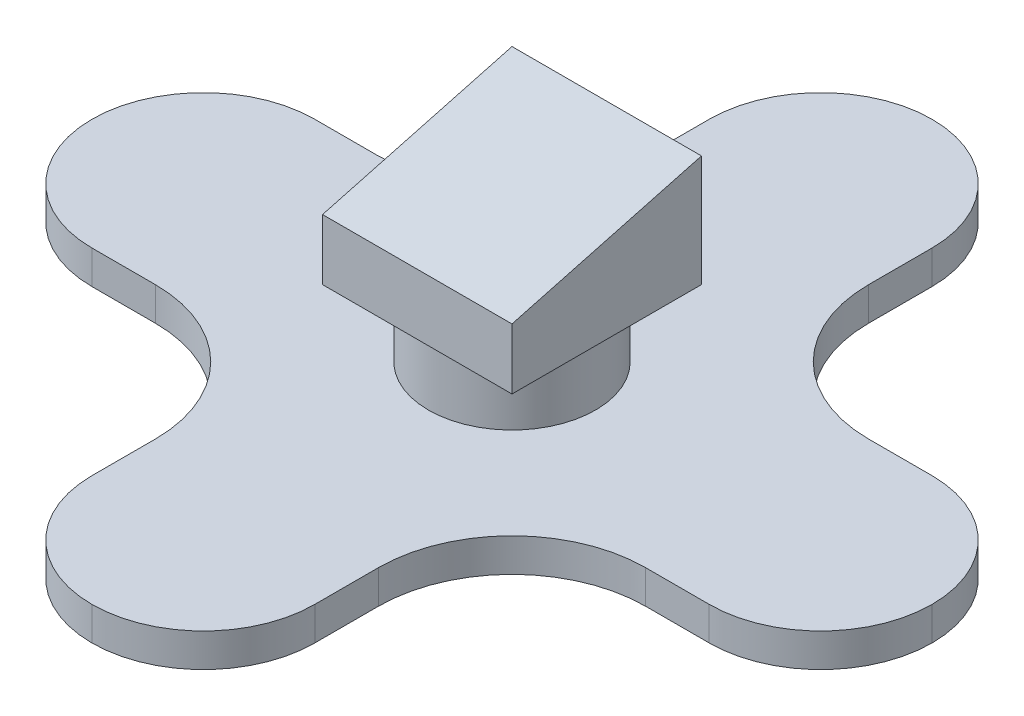
ISO-10303-21;
HEADER;
FILE_DESCRIPTION(('STEP AP214'),'2;1');
FILE_NAME('part.step','',(''),(''),'','','');
FILE_SCHEMA(('AUTOMOTIVE_DESIGN { 1 0 10303 214 1 1 1 1 }'));
ENDSEC;
DATA;
#1=APPLICATION_CONTEXT('core data for automotive mechanical design processes');
#2=APPLICATION_PROTOCOL_DEFINITION('international standard','automotive_design',2000,#1);
#3=PRODUCT_CONTEXT('',#1,'mechanical');
#4=PRODUCT('Part','Part','',(#3));
#5=PRODUCT_RELATED_PRODUCT_CATEGORY('part','',(#4));
#6=PRODUCT_DEFINITION_FORMATION('','',#4);
#7=PRODUCT_DEFINITION_CONTEXT('part definition',#1,'design');
#8=PRODUCT_DEFINITION('design','',#6,#7);
#9=PRODUCT_DEFINITION_SHAPE('','',#8);
#10=(LENGTH_UNIT() NAMED_UNIT(*) SI_UNIT(.MILLI.,.METRE.));
#11=(NAMED_UNIT(*) PLANE_ANGLE_UNIT() SI_UNIT($,.RADIAN.));
#12=(NAMED_UNIT(*) SI_UNIT($,.STERADIAN.) SOLID_ANGLE_UNIT());
#13=UNCERTAINTY_MEASURE_WITH_UNIT(LENGTH_MEASURE(1.E-05),#10,'distance_accuracy_value','');
#14=(GEOMETRIC_REPRESENTATION_CONTEXT(3) GLOBAL_UNCERTAINTY_ASSIGNED_CONTEXT((#13)) GLOBAL_UNIT_ASSIGNED_CONTEXT((#10,
#11,#12)) REPRESENTATION_CONTEXT('',''));
#15=CARTESIAN_POINT('',(0.,0.,0.));
#16=DIRECTION('',(0.,0.,1.));
#17=DIRECTION('',(1.,0.,0.));
#18=AXIS2_PLACEMENT_3D('',#15,#16,#17);
#19=CARTESIAN_POINT('',(-4.25,8.,4.25));
#20=DIRECTION('',(1.,0.,0.));
#21=DIRECTION('',(0.,0.,-1.));
#22=AXIS2_PLACEMENT_3D('',#19,#20,#21);
#23=PLANE('',#22);
#24=DIRECTION('',(0.,-0.258819045102525,0.965925826289067));
#25=VECTOR('',#24,1.);
#26=CARTESIAN_POINT('',(-4.25,5.72243186433542,4.25));
#27=LINE('',#26,#25);
#28=CARTESIAN_POINT('',(-4.25,8.,-4.25));
#29=VERTEX_POINT('',#28);
#30=CARTESIAN_POINT('',(-4.25,5.72243186433542,4.25));
#31=VERTEX_POINT('',#30);
#32=EDGE_CURVE('E250',#29,#31,#27,.T.);
#33=ORIENTED_EDGE('',*,*,#32,.F.);
#34=DIRECTION('',(0.,-1.,0.));
#35=VECTOR('',#34,1.);
#36=CARTESIAN_POINT('',(-4.25,8.,-4.25));
#37=LINE('',#36,#35);
#38=CARTESIAN_POINT('',(-4.25,3.,-4.25));
#39=VERTEX_POINT('',#38);
#40=EDGE_CURVE('E275',#29,#39,#37,.T.);
#41=ORIENTED_EDGE('',*,*,#40,.T.);
#42=DIRECTION('',(0.,0.,1.));
#43=VECTOR('',#42,1.);
#44=CARTESIAN_POINT('',(-4.25,3.,4.25));
#45=LINE('',#44,#43);
#46=CARTESIAN_POINT('',(-4.25,3.,4.25));
#47=VERTEX_POINT('',#46);
#48=EDGE_CURVE('E266',#39,#47,#45,.T.);
#49=ORIENTED_EDGE('',*,*,#48,.T.);
#50=DIRECTION('',(0.,-1.,0.));
#51=VECTOR('',#50,1.);
#52=CARTESIAN_POINT('',(-4.25,8.,4.25));
#53=LINE('',#52,#51);
#54=EDGE_CURVE('E262',#31,#47,#53,.T.);
#55=ORIENTED_EDGE('',*,*,#54,.F.);
#56=EDGE_LOOP('',(#33,#41,#49,#55));
#57=FACE_BOUND('',#56,.T.);
#58=ADVANCED_FACE('F87',(#57),#23,.F.);
#59=CARTESIAN_POINT('',(0.,3.,0.));
#60=DIRECTION('',(0.,-1.,0.));
#61=DIRECTION('',(0.,0.,-1.));
#62=AXIS2_PLACEMENT_3D('',#59,#60,#61);
#63=CYLINDRICAL_SURFACE('',#62,3.75);
#64=CARTESIAN_POINT('',(0.,3.,0.));
#65=DIRECTION('',(0.,1.,0.));
#66=DIRECTION('',(0.,0.,1.));
#67=AXIS2_PLACEMENT_3D('',#64,#65,#66);
#68=CIRCLE('',#67,3.75);
#69=CARTESIAN_POINT('',(0.,3.,3.75));
#70=VERTEX_POINT('',#69);
#71=EDGE_CURVE('E283',#70,#70,#68,.T.);
#72=ORIENTED_EDGE('',*,*,#71,.F.);
#73=EDGE_LOOP('',(#72));
#74=FACE_BOUND('',#73,.T.);
#75=CARTESIAN_POINT('',(0.,0.,0.));
#76=DIRECTION('',(0.,1.,0.));
#77=DIRECTION('',(0.,0.,1.));
#78=AXIS2_PLACEMENT_3D('',#75,#76,#77);
#79=CIRCLE('',#78,3.75);
#80=CARTESIAN_POINT('',(0.,0.,3.75));
#81=VERTEX_POINT('',#80);
#82=EDGE_CURVE('E260',#81,#81,#79,.T.);
#83=ORIENTED_EDGE('',*,*,#82,.T.);
#84=EDGE_LOOP('',(#83));
#85=FACE_BOUND('',#84,.T.);
#86=ADVANCED_FACE('F444',(#74,#85),#63,.T.);
#87=CARTESIAN_POINT('',(4.25,8.,4.25));
#88=DIRECTION('',(-1.,0.,0.));
#89=DIRECTION('',(0.,0.,1.));
#90=AXIS2_PLACEMENT_3D('',#87,#88,#89);
#91=PLANE('',#90);
#92=DIRECTION('',(0.,-1.,0.));
#93=VECTOR('',#92,1.);
#94=CARTESIAN_POINT('',(4.25,8.,-4.25));
#95=LINE('',#94,#93);
#96=CARTESIAN_POINT('',(4.25,8.,-4.25));
#97=VERTEX_POINT('',#96);
#98=CARTESIAN_POINT('',(4.25,3.,-4.25));
#99=VERTEX_POINT('',#98);
#100=EDGE_CURVE('E274',#97,#99,#95,.T.);
#101=ORIENTED_EDGE('',*,*,#100,.F.);
#102=DIRECTION('',(0.,-0.258819045102525,0.965925826289067));
#103=VECTOR('',#102,1.);
#104=CARTESIAN_POINT('',(4.25,5.87499999999997,3.68060796608385));
#105=LINE('',#104,#103);
#106=CARTESIAN_POINT('',(4.25,5.72243186433542,4.25));
#107=VERTEX_POINT('',#106);
#108=EDGE_CURVE('E282',#97,#107,#105,.T.);
#109=ORIENTED_EDGE('',*,*,#108,.T.);
#110=DIRECTION('',(0.,-1.,0.));
#111=VECTOR('',#110,1.);
#112=CARTESIAN_POINT('',(4.25,8.,4.25));
#113=LINE('',#112,#111);
#114=CARTESIAN_POINT('',(4.25,3.,4.25));
#115=VERTEX_POINT('',#114);
#116=EDGE_CURVE('E268',#107,#115,#113,.T.);
#117=ORIENTED_EDGE('',*,*,#116,.T.);
#118=DIRECTION('',(0.,0.,-1.));
#119=VECTOR('',#118,1.);
#120=CARTESIAN_POINT('',(4.25,3.,4.25));
#121=LINE('',#120,#119);
#122=EDGE_CURVE('E269',#115,#99,#121,.T.);
#123=ORIENTED_EDGE('',*,*,#122,.T.);
#124=EDGE_LOOP('',(#101,#109,#117,#123));
#125=FACE_BOUND('',#124,.T.);
#126=ADVANCED_FACE('F434',(#125),#91,.F.);
#127=CARTESIAN_POINT('',(-4.25,8.,-4.25));
#128=DIRECTION('',(0.,0.,1.));
#129=DIRECTION('',(1.,0.,0.));
#130=AXIS2_PLACEMENT_3D('',#127,#128,#129);
#131=PLANE('',#130);
#132=DIRECTION('',(-1.,0.,0.));
#133=VECTOR('',#132,1.);
#134=CARTESIAN_POINT('',(-4.25,3.,-4.25));
#135=LINE('',#134,#133);
#136=EDGE_CURVE('E426',#99,#39,#135,.T.);
#137=ORIENTED_EDGE('',*,*,#136,.T.);
#138=ORIENTED_EDGE('',*,*,#40,.F.);
#139=DIRECTION('',(-1.,0.,0.));
#140=VECTOR('',#139,1.);
#141=CARTESIAN_POINT('',(-4.25,8.,-4.25));
#142=LINE('',#141,#140);
#143=EDGE_CURVE('E254',#97,#29,#142,.T.);
#144=ORIENTED_EDGE('',*,*,#143,.F.);
#145=ORIENTED_EDGE('',*,*,#100,.T.);
#146=EDGE_LOOP('',(#137,#138,#144,#145));
#147=FACE_BOUND('',#146,.T.);
#148=ADVANCED_FACE('F440',(#147),#131,.F.);
#149=CARTESIAN_POINT('',(-4.25,8.,4.25));
#150=DIRECTION('',(0.,0.,-1.));
#151=DIRECTION('',(-1.,0.,0.));
#152=AXIS2_PLACEMENT_3D('',#149,#150,#151);
#153=PLANE('',#152);
#154=ORIENTED_EDGE('',*,*,#116,.F.);
#155=DIRECTION('',(-1.,0.,0.));
#156=VECTOR('',#155,1.);
#157=CARTESIAN_POINT('',(25.75,5.72243186433542,4.25));
#158=LINE('',#157,#156);
#159=EDGE_CURVE('E249',#107,#31,#158,.T.);
#160=ORIENTED_EDGE('',*,*,#159,.T.);
#161=ORIENTED_EDGE('',*,*,#54,.T.);
#162=DIRECTION('',(1.,0.,0.));
#163=VECTOR('',#162,1.);
#164=CARTESIAN_POINT('',(-4.25,3.,4.25));
#165=LINE('',#164,#163);
#166=EDGE_CURVE('E424',#47,#115,#165,.T.);
#167=ORIENTED_EDGE('',*,*,#166,.T.);
#168=EDGE_LOOP('',(#154,#160,#161,#167));
#169=FACE_BOUND('',#168,.T.);
#170=ADVANCED_FACE('F265',(#169),#153,.F.);
#171=CARTESIAN_POINT('',(0.,3.,0.));
#172=DIRECTION('',(0.,-1.,0.));
#173=DIRECTION('',(0.,0.,-1.));
#174=AXIS2_PLACEMENT_3D('',#171,#172,#173);
#175=PLANE('',#174);
#176=ORIENTED_EDGE('',*,*,#71,.T.);
#177=EDGE_LOOP('',(#176));
#178=FACE_BOUND('',#177,.T.);
#179=ORIENTED_EDGE('',*,*,#122,.F.);
#180=ORIENTED_EDGE('',*,*,#166,.F.);
#181=ORIENTED_EDGE('',*,*,#48,.F.);
#182=ORIENTED_EDGE('',*,*,#136,.F.);
#183=EDGE_LOOP('',(#179,#180,#181,#182));
#184=FACE_BOUND('',#183,.T.);
#185=ADVANCED_FACE('F435',(#178,#184),#175,.T.);
#186=CARTESIAN_POINT('',(25.75,5.72243186433542,4.25));
#187=DIRECTION('',(0.,-0.965925826289067,-0.258819045102525));
#188=DIRECTION('',(0.,0.258819045102525,-0.965925826289067));
#189=AXIS2_PLACEMENT_3D('',#186,#187,#188);
#190=PLANE('',#189);
#191=ORIENTED_EDGE('',*,*,#143,.T.);
#192=ORIENTED_EDGE('',*,*,#32,.T.);
#193=ORIENTED_EDGE('',*,*,#159,.F.);
#194=ORIENTED_EDGE('',*,*,#108,.F.);
#195=EDGE_LOOP('',(#191,#192,#193,#194));
#196=FACE_BOUND('',#195,.T.);
#197=ADVANCED_FACE('F248',(#196),#190,.F.);
#198=CARTESIAN_POINT('',(0.,-1.5,5.));
#199=DIRECTION('',(0.,0.,1.));
#200=DIRECTION('',(1.,0.,0.));
#201=AXIS2_PLACEMENT_3D('',#198,#199,#200);
#202=PLANE('',#201);
#203=DIRECTION('',(1.,0.,0.));
#204=VECTOR('',#203,1.);
#205=CARTESIAN_POINT('',(0.,0.,5.));
#206=LINE('',#205,#204);
#207=CARTESIAN_POINT('',(11.,0.,5.));
#208=VERTEX_POINT('',#207);
#209=CARTESIAN_POINT('',(13.8480768249708,0.,5.));
#210=VERTEX_POINT('',#209);
#211=EDGE_CURVE('E716',#208,#210,#206,.T.);
#212=ORIENTED_EDGE('',*,*,#211,.F.);
#213=DIRECTION('',(0.,1.,0.));
#214=VECTOR('',#213,1.);
#215=CARTESIAN_POINT('',(11.,-1.5,5.));
#216=LINE('',#215,#214);
#217=CARTESIAN_POINT('',(11.,-1.5,5.));
#218=VERTEX_POINT('',#217);
#219=EDGE_CURVE('E109',#208,#218,#216,.F.);
#220=ORIENTED_EDGE('',*,*,#219,.T.);
#221=DIRECTION('',(1.,0.,0.));
#222=VECTOR('',#221,1.);
#223=CARTESIAN_POINT('',(0.,-1.5,5.));
#224=LINE('',#223,#222);
#225=CARTESIAN_POINT('',(13.8480768249708,-1.5,5.));
#226=VERTEX_POINT('',#225);
#227=EDGE_CURVE('E404',#218,#226,#224,.T.);
#228=ORIENTED_EDGE('',*,*,#227,.T.);
#229=DIRECTION('',(0.,1.,0.));
#230=VECTOR('',#229,1.);
#231=CARTESIAN_POINT('',(13.8480768249708,-1.5,5.));
#232=LINE('',#231,#230);
#233=EDGE_CURVE('E339',#226,#210,#232,.T.);
#234=ORIENTED_EDGE('',*,*,#233,.T.);
#235=EDGE_LOOP('',(#212,#220,#228,#234));
#236=FACE_BOUND('',#235,.T.);
#237=ADVANCED_FACE('F459',(#236),#202,.T.);
#238=CARTESIAN_POINT('',(0.,-1.5,-5.));
#239=DIRECTION('',(0.,0.,1.));
#240=DIRECTION('',(1.,0.,0.));
#241=AXIS2_PLACEMENT_3D('',#238,#239,#240);
#242=PLANE('',#241);
#243=DIRECTION('',(1.,0.,0.));
#244=VECTOR('',#243,1.);
#245=CARTESIAN_POINT('',(0.,-1.5,-5.));
#246=LINE('',#245,#244);
#247=CARTESIAN_POINT('',(11.,-1.5,-5.));
#248=VERTEX_POINT('',#247);
#249=CARTESIAN_POINT('',(13.8480768249708,-1.5,-5.));
#250=VERTEX_POINT('',#249);
#251=EDGE_CURVE('E289',#248,#250,#246,.T.);
#252=ORIENTED_EDGE('',*,*,#251,.F.);
#253=DIRECTION('',(0.,1.,0.));
#254=VECTOR('',#253,1.);
#255=CARTESIAN_POINT('',(11.,-1.5,-5.));
#256=LINE('',#255,#254);
#257=CARTESIAN_POINT('',(11.,0.,-5.));
#258=VERTEX_POINT('',#257);
#259=EDGE_CURVE('E369',#248,#258,#256,.T.);
#260=ORIENTED_EDGE('',*,*,#259,.T.);
#261=DIRECTION('',(1.,0.,0.));
#262=VECTOR('',#261,1.);
#263=CARTESIAN_POINT('',(0.,0.,-5.));
#264=LINE('',#263,#262);
#265=CARTESIAN_POINT('',(13.8480768249708,0.,-5.));
#266=VERTEX_POINT('',#265);
#267=EDGE_CURVE('E407',#258,#266,#264,.T.);
#268=ORIENTED_EDGE('',*,*,#267,.T.);
#269=DIRECTION('',(0.,1.,0.));
#270=VECTOR('',#269,1.);
#271=CARTESIAN_POINT('',(13.8480768249708,-1.5,-5.));
#272=LINE('',#271,#270);
#273=EDGE_CURVE('E310',#266,#250,#272,.F.);
#274=ORIENTED_EDGE('',*,*,#273,.T.);
#275=EDGE_LOOP('',(#252,#260,#268,#274));
#276=FACE_BOUND('',#275,.T.);
#277=ADVANCED_FACE('F402',(#276),#242,.F.);
#278=CARTESIAN_POINT('',(0.,-1.5,0.));
#279=DIRECTION('',(0.,-1.,0.));
#280=DIRECTION('',(0.,0.,-1.));
#281=AXIS2_PLACEMENT_3D('',#278,#279,#280);
#282=PLANE('',#281);
#283=CARTESIAN_POINT('',(0.,-1.5,-13.8480768249708));
#284=DIRECTION('',(0.,-1.,0.));
#285=DIRECTION('',(0.,0.,-1.));
#286=AXIS2_PLACEMENT_3D('',#283,#284,#285);
#287=CIRCLE('',#286,5.);
#288=CARTESIAN_POINT('',(-5.,-1.5,-13.8480768249708));
#289=VERTEX_POINT('',#288);
#290=CARTESIAN_POINT('',(0.,-1.5,-18.8480768249708));
#291=VERTEX_POINT('',#290);
#292=EDGE_CURVE('E325',#289,#291,#287,.T.);
#293=ORIENTED_EDGE('',*,*,#292,.T.);
#294=CARTESIAN_POINT('',(0.,-1.5,-13.8480768249708));
#295=DIRECTION('',(0.,-1.,0.));
#296=DIRECTION('',(0.,0.,-1.));
#297=AXIS2_PLACEMENT_3D('',#294,#295,#296);
#298=CIRCLE('',#297,5.);
#299=CARTESIAN_POINT('',(5.,-1.5,-13.8480768249708));
#300=VERTEX_POINT('',#299);
#301=EDGE_CURVE('E322',#291,#300,#298,.T.);
#302=ORIENTED_EDGE('',*,*,#301,.T.);
#303=DIRECTION('',(0.,0.,-1.));
#304=VECTOR('',#303,1.);
#305=CARTESIAN_POINT('',(5.,-1.5,18.8480768249708));
#306=LINE('',#305,#304);
#307=CARTESIAN_POINT('',(5.,-1.5,-11.));
#308=VERTEX_POINT('',#307);
#309=EDGE_CURVE('E398',#308,#300,#306,.T.);
#310=ORIENTED_EDGE('',*,*,#309,.F.);
#311=CARTESIAN_POINT('',(11.,-1.5,-11.));
#312=DIRECTION('',(0.,-1.,0.));
#313=DIRECTION('',(0.,0.,-1.));
#314=AXIS2_PLACEMENT_3D('',#311,#312,#313);
#315=CIRCLE('',#314,6.);
#316=EDGE_CURVE('E388',#308,#248,#315,.F.);
#317=ORIENTED_EDGE('',*,*,#316,.T.);
#318=ORIENTED_EDGE('',*,*,#251,.T.);
#319=CARTESIAN_POINT('',(13.8480768249708,-1.5,0.));
#320=DIRECTION('',(0.,-1.,0.));
#321=DIRECTION('',(0.,0.,-1.));
#322=AXIS2_PLACEMENT_3D('',#319,#320,#321);
#323=CIRCLE('',#322,5.);
#324=CARTESIAN_POINT('',(18.8480768249708,-1.5,0.));
#325=VERTEX_POINT('',#324);
#326=EDGE_CURVE('E320',#250,#325,#323,.T.);
#327=ORIENTED_EDGE('',*,*,#326,.T.);
#328=CARTESIAN_POINT('',(13.8480768249708,-1.5,0.));
#329=DIRECTION('',(0.,-1.,0.));
#330=DIRECTION('',(0.,0.,-1.));
#331=AXIS2_PLACEMENT_3D('',#328,#329,#330);
#332=CIRCLE('',#331,5.);
#333=EDGE_CURVE('E313',#325,#226,#332,.T.);
#334=ORIENTED_EDGE('',*,*,#333,.T.);
#335=ORIENTED_EDGE('',*,*,#227,.F.);
#336=CARTESIAN_POINT('',(11.,-1.5,11.));
#337=DIRECTION('',(0.,-1.,0.));
#338=DIRECTION('',(0.,0.,-1.));
#339=AXIS2_PLACEMENT_3D('',#336,#337,#338);
#340=CIRCLE('',#339,6.);
#341=CARTESIAN_POINT('',(5.,-1.5,11.));
#342=VERTEX_POINT('',#341);
#343=EDGE_CURVE('E12',#218,#342,#340,.F.);
#344=ORIENTED_EDGE('',*,*,#343,.T.);
#345=CARTESIAN_POINT('',(5.,-1.5,13.8480768249708));
#346=VERTEX_POINT('',#345);
#347=EDGE_CURVE('E738',#346,#342,#306,.T.);
#348=ORIENTED_EDGE('',*,*,#347,.F.);
#349=CARTESIAN_POINT('',(0.,-1.5,13.8480768249708));
#350=DIRECTION('',(0.,-1.,0.));
#351=DIRECTION('',(0.,0.,-1.));
#352=AXIS2_PLACEMENT_3D('',#349,#350,#351);
#353=CIRCLE('',#352,5.);
#354=CARTESIAN_POINT('',(0.,-1.5,18.8480768249708));
#355=VERTEX_POINT('',#354);
#356=EDGE_CURVE('E315',#346,#355,#353,.T.);
#357=ORIENTED_EDGE('',*,*,#356,.T.);
#358=CARTESIAN_POINT('',(0.,-1.5,13.8480768249708));
#359=DIRECTION('',(0.,-1.,0.));
#360=DIRECTION('',(0.,0.,-1.));
#361=AXIS2_PLACEMENT_3D('',#358,#359,#360);
#362=CIRCLE('',#361,5.);
#363=CARTESIAN_POINT('',(-5.,-1.5,13.8480768249708));
#364=VERTEX_POINT('',#363);
#365=EDGE_CURVE('E309',#355,#364,#362,.T.);
#366=ORIENTED_EDGE('',*,*,#365,.T.);
#367=DIRECTION('',(0.,0.,-1.));
#368=VECTOR('',#367,1.);
#369=CARTESIAN_POINT('',(-5.,-1.5,18.8480768249708));
#370=LINE('',#369,#368);
#371=CARTESIAN_POINT('',(-5.,-1.5,11.));
#372=VERTEX_POINT('',#371);
#373=EDGE_CURVE('E420',#364,#372,#370,.T.);
#374=ORIENTED_EDGE('',*,*,#373,.T.);
#375=CARTESIAN_POINT('',(-11.,-1.5,11.));
#376=DIRECTION('',(0.,-1.,0.));
#377=DIRECTION('',(0.,0.,-1.));
#378=AXIS2_PLACEMENT_3D('',#375,#376,#377);
#379=CIRCLE('',#378,6.);
#380=CARTESIAN_POINT('',(-11.,-1.5,5.));
#381=VERTEX_POINT('',#380);
#382=EDGE_CURVE('E382',#372,#381,#379,.F.);
#383=ORIENTED_EDGE('',*,*,#382,.T.);
#384=DIRECTION('',(1.,0.,0.));
#385=VECTOR('',#384,1.);
#386=CARTESIAN_POINT('',(0.,-1.5,5.));
#387=LINE('',#386,#385);
#388=CARTESIAN_POINT('',(-13.8480768249708,-1.5,5.));
#389=VERTEX_POINT('',#388);
#390=EDGE_CURVE('E724',#389,#381,#387,.T.);
#391=ORIENTED_EDGE('',*,*,#390,.F.);
#392=CARTESIAN_POINT('',(-13.8480768249708,-1.5,0.));
#393=DIRECTION('',(0.,-1.,0.));
#394=DIRECTION('',(0.,0.,-1.));
#395=AXIS2_PLACEMENT_3D('',#392,#393,#394);
#396=CIRCLE('',#395,5.);
#397=CARTESIAN_POINT('',(-18.8480768249708,-1.5,0.));
#398=VERTEX_POINT('',#397);
#399=EDGE_CURVE('E316',#389,#398,#396,.T.);
#400=ORIENTED_EDGE('',*,*,#399,.T.);
#401=CARTESIAN_POINT('',(-13.8480768249708,-1.5,0.));
#402=DIRECTION('',(0.,-1.,0.));
#403=DIRECTION('',(0.,0.,-1.));
#404=AXIS2_PLACEMENT_3D('',#401,#402,#403);
#405=CIRCLE('',#404,5.);
#406=CARTESIAN_POINT('',(-13.8480768249708,-1.5,-5.));
#407=VERTEX_POINT('',#406);
#408=EDGE_CURVE('E324',#398,#407,#405,.T.);
#409=ORIENTED_EDGE('',*,*,#408,.T.);
#410=DIRECTION('',(1.,0.,0.));
#411=VECTOR('',#410,1.);
#412=CARTESIAN_POINT('',(0.,-1.5,-5.));
#413=LINE('',#412,#411);
#414=CARTESIAN_POINT('',(-11.,-1.5,-5.));
#415=VERTEX_POINT('',#414);
#416=EDGE_CURVE('E727',#407,#415,#413,.T.);
#417=ORIENTED_EDGE('',*,*,#416,.T.);
#418=CARTESIAN_POINT('',(-11.,-1.5,-11.));
#419=DIRECTION('',(0.,-1.,0.));
#420=DIRECTION('',(0.,0.,-1.));
#421=AXIS2_PLACEMENT_3D('',#418,#419,#420);
#422=CIRCLE('',#421,6.);
#423=CARTESIAN_POINT('',(-5.,-1.5,-11.));
#424=VERTEX_POINT('',#423);
#425=EDGE_CURVE('E383',#415,#424,#422,.F.);
#426=ORIENTED_EDGE('',*,*,#425,.T.);
#427=EDGE_CURVE('E736',#424,#289,#370,.T.);
#428=ORIENTED_EDGE('',*,*,#427,.T.);
#429=EDGE_LOOP('',(#293,#302,#310,#317,#318,#327,#334,#335,#344,#348,#357,#366,#374,#383,#391,
#400,#409,#417,#426,#428));
#430=FACE_BOUND('',#429,.T.);
#431=ADVANCED_FACE('F392',(#430),#282,.T.);
#432=CARTESIAN_POINT('',(0.,0.,0.));
#433=DIRECTION('',(0.,-1.,0.));
#434=DIRECTION('',(0.,0.,-1.));
#435=AXIS2_PLACEMENT_3D('',#432,#433,#434);
#436=PLANE('',#435);
#437=ORIENTED_EDGE('',*,*,#82,.F.);
#438=EDGE_LOOP('',(#437));
#439=FACE_BOUND('',#438,.T.);
#440=ORIENTED_EDGE('',*,*,#267,.F.);
#441=CARTESIAN_POINT('',(11.,0.,-11.));
#442=DIRECTION('',(0.,-1.,0.));
#443=DIRECTION('',(0.,0.,-1.));
#444=AXIS2_PLACEMENT_3D('',#441,#442,#443);
#445=CIRCLE('',#444,6.);
#446=CARTESIAN_POINT('',(5.,0.,-11.));
#447=VERTEX_POINT('',#446);
#448=EDGE_CURVE('E386',#258,#447,#445,.T.);
#449=ORIENTED_EDGE('',*,*,#448,.T.);
#450=DIRECTION('',(0.,0.,-1.));
#451=VECTOR('',#450,1.);
#452=CARTESIAN_POINT('',(5.,0.,18.8480768249708));
#453=LINE('',#452,#451);
#454=CARTESIAN_POINT('',(5.,0.,-13.8480768249708));
#455=VERTEX_POINT('',#454);
#456=EDGE_CURVE('E353',#447,#455,#453,.T.);
#457=ORIENTED_EDGE('',*,*,#456,.T.);
#458=CARTESIAN_POINT('',(0.,0.,-13.8480768249708));
#459=DIRECTION('',(0.,-1.,0.));
#460=DIRECTION('',(0.,0.,-1.));
#461=AXIS2_PLACEMENT_3D('',#458,#459,#460);
#462=CIRCLE('',#461,5.);
#463=CARTESIAN_POINT('',(0.,0.,-18.8480768249708));
#464=VERTEX_POINT('',#463);
#465=EDGE_CURVE('E304',#455,#464,#462,.F.);
#466=ORIENTED_EDGE('',*,*,#465,.T.);
#467=CARTESIAN_POINT('',(0.,0.,-13.8480768249708));
#468=DIRECTION('',(0.,-1.,0.));
#469=DIRECTION('',(0.,0.,-1.));
#470=AXIS2_PLACEMENT_3D('',#467,#468,#469);
#471=CIRCLE('',#470,5.);
#472=CARTESIAN_POINT('',(-5.,0.,-13.8480768249708));
#473=VERTEX_POINT('',#472);
#474=EDGE_CURVE('E305',#464,#473,#471,.F.);
#475=ORIENTED_EDGE('',*,*,#474,.T.);
#476=DIRECTION('',(0.,0.,-1.));
#477=VECTOR('',#476,1.);
#478=CARTESIAN_POINT('',(-5.,0.,18.8480768249708));
#479=LINE('',#478,#477);
#480=CARTESIAN_POINT('',(-5.,0.,-11.));
#481=VERTEX_POINT('',#480);
#482=EDGE_CURVE('E418',#481,#473,#479,.T.);
#483=ORIENTED_EDGE('',*,*,#482,.F.);
#484=CARTESIAN_POINT('',(-11.,0.,-11.));
#485=DIRECTION('',(0.,-1.,0.));
#486=DIRECTION('',(0.,0.,-1.));
#487=AXIS2_PLACEMENT_3D('',#484,#485,#486);
#488=CIRCLE('',#487,6.);
#489=CARTESIAN_POINT('',(-11.,0.,-5.));
#490=VERTEX_POINT('',#489);
#491=EDGE_CURVE('E384',#481,#490,#488,.T.);
#492=ORIENTED_EDGE('',*,*,#491,.T.);
#493=DIRECTION('',(1.,0.,0.));
#494=VECTOR('',#493,1.);
#495=CARTESIAN_POINT('',(0.,0.,-5.));
#496=LINE('',#495,#494);
#497=CARTESIAN_POINT('',(-13.8480768249708,0.,-5.));
#498=VERTEX_POINT('',#497);
#499=EDGE_CURVE('E731',#498,#490,#496,.T.);
#500=ORIENTED_EDGE('',*,*,#499,.F.);
#501=CARTESIAN_POINT('',(-13.8480768249708,0.,0.));
#502=DIRECTION('',(0.,-1.,0.));
#503=DIRECTION('',(0.,0.,-1.));
#504=AXIS2_PLACEMENT_3D('',#501,#502,#503);
#505=CIRCLE('',#504,5.);
#506=CARTESIAN_POINT('',(-18.8480768249708,0.,0.));
#507=VERTEX_POINT('',#506);
#508=EDGE_CURVE('E297',#498,#507,#505,.F.);
#509=ORIENTED_EDGE('',*,*,#508,.T.);
#510=CARTESIAN_POINT('',(-13.8480768249708,0.,0.));
#511=DIRECTION('',(0.,-1.,0.));
#512=DIRECTION('',(0.,0.,-1.));
#513=AXIS2_PLACEMENT_3D('',#510,#511,#512);
#514=CIRCLE('',#513,5.);
#515=CARTESIAN_POINT('',(-13.8480768249708,0.,5.));
#516=VERTEX_POINT('',#515);
#517=EDGE_CURVE('E296',#507,#516,#514,.F.);
#518=ORIENTED_EDGE('',*,*,#517,.T.);
#519=DIRECTION('',(1.,0.,0.));
#520=VECTOR('',#519,1.);
#521=CARTESIAN_POINT('',(0.,0.,5.));
#522=LINE('',#521,#520);
#523=CARTESIAN_POINT('',(-11.,0.,5.));
#524=VERTEX_POINT('',#523);
#525=EDGE_CURVE('E728',#516,#524,#522,.T.);
#526=ORIENTED_EDGE('',*,*,#525,.T.);
#527=CARTESIAN_POINT('',(-11.,0.,11.));
#528=DIRECTION('',(0.,-1.,0.));
#529=DIRECTION('',(0.,0.,-1.));
#530=AXIS2_PLACEMENT_3D('',#527,#528,#529);
#531=CIRCLE('',#530,6.);
#532=CARTESIAN_POINT('',(-5.,0.,11.));
#533=VERTEX_POINT('',#532);
#534=EDGE_CURVE('E378',#524,#533,#531,.T.);
#535=ORIENTED_EDGE('',*,*,#534,.T.);
#536=CARTESIAN_POINT('',(-5.,0.,13.8480768249708));
#537=VERTEX_POINT('',#536);
#538=EDGE_CURVE('E423',#537,#533,#479,.T.);
#539=ORIENTED_EDGE('',*,*,#538,.F.);
#540=CARTESIAN_POINT('',(0.,0.,13.8480768249708));
#541=DIRECTION('',(0.,-1.,0.));
#542=DIRECTION('',(0.,0.,-1.));
#543=AXIS2_PLACEMENT_3D('',#540,#541,#542);
#544=CIRCLE('',#543,5.);
#545=CARTESIAN_POINT('',(0.,0.,18.8480768249708));
#546=VERTEX_POINT('',#545);
#547=EDGE_CURVE('E290',#537,#546,#544,.F.);
#548=ORIENTED_EDGE('',*,*,#547,.T.);
#549=CARTESIAN_POINT('',(0.,0.,13.8480768249708));
#550=DIRECTION('',(0.,-1.,0.));
#551=DIRECTION('',(0.,0.,-1.));
#552=AXIS2_PLACEMENT_3D('',#549,#550,#551);
#553=CIRCLE('',#552,5.);
#554=CARTESIAN_POINT('',(5.,0.,13.8480768249708));
#555=VERTEX_POINT('',#554);
#556=EDGE_CURVE('E293',#546,#555,#553,.F.);
#557=ORIENTED_EDGE('',*,*,#556,.T.);
#558=CARTESIAN_POINT('',(5.,0.,11.));
#559=VERTEX_POINT('',#558);
#560=EDGE_CURVE('E412',#555,#559,#453,.T.);
#561=ORIENTED_EDGE('',*,*,#560,.T.);
#562=CARTESIAN_POINT('',(11.,0.,11.));
#563=DIRECTION('',(0.,-1.,0.));
#564=DIRECTION('',(0.,0.,-1.));
#565=AXIS2_PLACEMENT_3D('',#562,#563,#564);
#566=CIRCLE('',#565,6.);
#567=EDGE_CURVE('E97',#559,#208,#566,.T.);
#568=ORIENTED_EDGE('',*,*,#567,.T.);
#569=ORIENTED_EDGE('',*,*,#211,.T.);
#570=CARTESIAN_POINT('',(13.8480768249708,0.,0.));
#571=DIRECTION('',(0.,-1.,0.));
#572=DIRECTION('',(0.,0.,-1.));
#573=AXIS2_PLACEMENT_3D('',#570,#571,#572);
#574=CIRCLE('',#573,5.);
#575=CARTESIAN_POINT('',(18.8480768249708,0.,0.));
#576=VERTEX_POINT('',#575);
#577=EDGE_CURVE('E291',#210,#576,#574,.F.);
#578=ORIENTED_EDGE('',*,*,#577,.T.);
#579=CARTESIAN_POINT('',(13.8480768249708,0.,0.));
#580=DIRECTION('',(0.,-1.,0.));
#581=DIRECTION('',(0.,0.,-1.));
#582=AXIS2_PLACEMENT_3D('',#579,#580,#581);
#583=CIRCLE('',#582,5.);
#584=EDGE_CURVE('E294',#576,#266,#583,.F.);
#585=ORIENTED_EDGE('',*,*,#584,.T.);
#586=EDGE_LOOP('',(#440,#449,#457,#466,#475,#483,#492,#500,#509,#518,#526,#535,#539,#548,#557,
#561,#568,#569,#578,#585));
#587=FACE_BOUND('',#586,.T.);
#588=ADVANCED_FACE('F410',(#439,#587),#436,.F.);
#589=CARTESIAN_POINT('',(0.,-1.5,-5.));
#590=DIRECTION('',(0.,0.,1.));
#591=DIRECTION('',(1.,0.,0.));
#592=AXIS2_PLACEMENT_3D('',#589,#590,#591);
#593=PLANE('',#592);
#594=ORIENTED_EDGE('',*,*,#499,.T.);
#595=DIRECTION('',(0.,1.,0.));
#596=VECTOR('',#595,1.);
#597=CARTESIAN_POINT('',(-11.,-1.5,-5.));
#598=LINE('',#597,#596);
#599=EDGE_CURVE('E368',#490,#415,#598,.F.);
#600=ORIENTED_EDGE('',*,*,#599,.T.);
#601=ORIENTED_EDGE('',*,*,#416,.F.);
#602=DIRECTION('',(0.,1.,0.));
#603=VECTOR('',#602,1.);
#604=CARTESIAN_POINT('',(-13.8480768249708,-1.5,-5.));
#605=LINE('',#604,#603);
#606=EDGE_CURVE('E335',#407,#498,#605,.T.);
#607=ORIENTED_EDGE('',*,*,#606,.T.);
#608=EDGE_LOOP('',(#594,#600,#601,#607));
#609=FACE_BOUND('',#608,.T.);
#610=ADVANCED_FACE('F467',(#609),#593,.F.);
#611=CARTESIAN_POINT('',(0.,-1.5,5.));
#612=DIRECTION('',(0.,0.,1.));
#613=DIRECTION('',(1.,0.,0.));
#614=AXIS2_PLACEMENT_3D('',#611,#612,#613);
#615=PLANE('',#614);
#616=ORIENTED_EDGE('',*,*,#390,.T.);
#617=DIRECTION('',(0.,1.,0.));
#618=VECTOR('',#617,1.);
#619=CARTESIAN_POINT('',(-11.,-1.5,5.));
#620=LINE('',#619,#618);
#621=EDGE_CURVE('E350',#381,#524,#620,.T.);
#622=ORIENTED_EDGE('',*,*,#621,.T.);
#623=ORIENTED_EDGE('',*,*,#525,.F.);
#624=DIRECTION('',(0.,1.,0.));
#625=VECTOR('',#624,1.);
#626=CARTESIAN_POINT('',(-13.8480768249708,-1.5,5.));
#627=LINE('',#626,#625);
#628=EDGE_CURVE('E340',#516,#389,#627,.F.);
#629=ORIENTED_EDGE('',*,*,#628,.T.);
#630=EDGE_LOOP('',(#616,#622,#623,#629));
#631=FACE_BOUND('',#630,.T.);
#632=ADVANCED_FACE('F475',(#631),#615,.T.);
#633=CARTESIAN_POINT('',(-5.,-1.5,18.8480768249708));
#634=DIRECTION('',(1.,0.,0.));
#635=DIRECTION('',(0.,0.,-1.));
#636=AXIS2_PLACEMENT_3D('',#633,#634,#635);
#637=PLANE('',#636);
#638=ORIENTED_EDGE('',*,*,#427,.F.);
#639=DIRECTION('',(0.,1.,0.));
#640=VECTOR('',#639,1.);
#641=CARTESIAN_POINT('',(-5.,0.,-11.));
#642=LINE('',#641,#640);
#643=EDGE_CURVE('E362',#424,#481,#642,.T.);
#644=ORIENTED_EDGE('',*,*,#643,.T.);
#645=ORIENTED_EDGE('',*,*,#482,.T.);
#646=DIRECTION('',(0.,1.,0.));
#647=VECTOR('',#646,1.);
#648=CARTESIAN_POINT('',(-5.,-1.5,-13.8480768249708));
#649=LINE('',#648,#647);
#650=EDGE_CURVE('E333',#473,#289,#649,.F.);
#651=ORIENTED_EDGE('',*,*,#650,.T.);
#652=EDGE_LOOP('',(#638,#644,#645,#651));
#653=FACE_BOUND('',#652,.T.);
#654=ADVANCED_FACE('F469',(#653),#637,.F.);
#655=ORIENTED_EDGE('',*,*,#538,.T.);
#656=DIRECTION('',(0.,1.,0.));
#657=VECTOR('',#656,1.);
#658=CARTESIAN_POINT('',(-5.,-1.5,11.));
#659=LINE('',#658,#657);
#660=EDGE_CURVE('E361',#533,#372,#659,.F.);
#661=ORIENTED_EDGE('',*,*,#660,.T.);
#662=ORIENTED_EDGE('',*,*,#373,.F.);
#663=DIRECTION('',(0.,1.,0.));
#664=VECTOR('',#663,1.);
#665=CARTESIAN_POINT('',(-5.,0.,13.8480768249708));
#666=LINE('',#665,#664);
#667=EDGE_CURVE('E342',#364,#537,#666,.T.);
#668=ORIENTED_EDGE('',*,*,#667,.T.);
#669=EDGE_LOOP('',(#655,#661,#662,#668));
#670=FACE_BOUND('',#669,.T.);
#671=ADVANCED_FACE('F465',(#670),#637,.F.);
#672=CARTESIAN_POINT('',(5.,-1.5,18.8480768249708));
#673=DIRECTION('',(1.,0.,0.));
#674=DIRECTION('',(0.,0.,-1.));
#675=AXIS2_PLACEMENT_3D('',#672,#673,#674);
#676=PLANE('',#675);
#677=ORIENTED_EDGE('',*,*,#347,.T.);
#678=DIRECTION('',(0.,1.,0.));
#679=VECTOR('',#678,1.);
#680=CARTESIAN_POINT('',(5.,0.,11.));
#681=LINE('',#680,#679);
#682=EDGE_CURVE('E374',#342,#559,#681,.T.);
#683=ORIENTED_EDGE('',*,*,#682,.T.);
#684=ORIENTED_EDGE('',*,*,#560,.F.);
#685=DIRECTION('',(0.,1.,0.));
#686=VECTOR('',#685,1.);
#687=CARTESIAN_POINT('',(5.,-1.5,13.8480768249708));
#688=LINE('',#687,#686);
#689=EDGE_CURVE('E341',#555,#346,#688,.F.);
#690=ORIENTED_EDGE('',*,*,#689,.T.);
#691=EDGE_LOOP('',(#677,#683,#684,#690));
#692=FACE_BOUND('',#691,.T.);
#693=ADVANCED_FACE('F463',(#692),#676,.T.);
#694=ORIENTED_EDGE('',*,*,#456,.F.);
#695=DIRECTION('',(0.,1.,0.));
#696=VECTOR('',#695,1.);
#697=CARTESIAN_POINT('',(5.,-1.5,-11.));
#698=LINE('',#697,#696);
#699=EDGE_CURVE('E373',#447,#308,#698,.F.);
#700=ORIENTED_EDGE('',*,*,#699,.T.);
#701=ORIENTED_EDGE('',*,*,#309,.T.);
#702=DIRECTION('',(0.,1.,0.));
#703=VECTOR('',#702,1.);
#704=CARTESIAN_POINT('',(5.,0.,-13.8480768249708));
#705=LINE('',#704,#703);
#706=EDGE_CURVE('E326',#300,#455,#705,.T.);
#707=ORIENTED_EDGE('',*,*,#706,.T.);
#708=EDGE_LOOP('',(#694,#700,#701,#707));
#709=FACE_BOUND('',#708,.T.);
#710=ADVANCED_FACE('F415',(#709),#676,.T.);
#711=CARTESIAN_POINT('',(13.8480768249708,-1.5,0.));
#712=DIRECTION('',(0.,1.,0.));
#713=DIRECTION('',(0.,0.,1.));
#714=AXIS2_PLACEMENT_3D('',#711,#712,#713);
#715=CYLINDRICAL_SURFACE('',#714,5.);
#716=ORIENTED_EDGE('',*,*,#233,.F.);
#717=ORIENTED_EDGE('',*,*,#333,.F.);
#718=DIRECTION('',(0.,1.,0.));
#719=VECTOR('',#718,1.);
#720=CARTESIAN_POINT('',(18.8480768249708,-1.5,0.));
#721=LINE('',#720,#719);
#722=EDGE_CURVE('E346',#576,#325,#721,.F.);
#723=ORIENTED_EDGE('',*,*,#722,.F.);
#724=ORIENTED_EDGE('',*,*,#577,.F.);
#725=EDGE_LOOP('',(#716,#717,#723,#724));
#726=FACE_BOUND('',#725,.T.);
#727=ADVANCED_FACE('F481',(#726),#715,.T.);
#728=CARTESIAN_POINT('',(13.8480768249708,-1.5,0.));
#729=DIRECTION('',(0.,-1.,0.));
#730=DIRECTION('',(0.,0.,-1.));
#731=AXIS2_PLACEMENT_3D('',#728,#729,#730);
#732=CYLINDRICAL_SURFACE('',#731,5.);
#733=ORIENTED_EDGE('',*,*,#326,.F.);
#734=ORIENTED_EDGE('',*,*,#273,.F.);
#735=ORIENTED_EDGE('',*,*,#584,.F.);
#736=ORIENTED_EDGE('',*,*,#722,.T.);
#737=EDGE_LOOP('',(#733,#734,#735,#736));
#738=FACE_BOUND('',#737,.T.);
#739=ADVANCED_FACE('F619',(#738),#732,.T.);
#740=CARTESIAN_POINT('',(0.,-1.5,-13.8480768249708));
#741=DIRECTION('',(0.,1.,0.));
#742=DIRECTION('',(0.,0.,1.));
#743=AXIS2_PLACEMENT_3D('',#740,#741,#742);
#744=CYLINDRICAL_SURFACE('',#743,5.);
#745=DIRECTION('',(0.,1.,0.));
#746=VECTOR('',#745,1.);
#747=CARTESIAN_POINT('',(0.,-1.5,-18.8480768249708));
#748=LINE('',#747,#746);
#749=EDGE_CURVE('E354',#291,#464,#748,.T.);
#750=ORIENTED_EDGE('',*,*,#749,.F.);
#751=ORIENTED_EDGE('',*,*,#292,.F.);
#752=ORIENTED_EDGE('',*,*,#650,.F.);
#753=ORIENTED_EDGE('',*,*,#474,.F.);
#754=EDGE_LOOP('',(#750,#751,#752,#753));
#755=FACE_BOUND('',#754,.T.);
#756=ADVANCED_FACE('F613',(#755),#744,.T.);
#757=CARTESIAN_POINT('',(0.,-1.5,-13.8480768249708));
#758=DIRECTION('',(0.,-1.,0.));
#759=DIRECTION('',(0.,0.,-1.));
#760=AXIS2_PLACEMENT_3D('',#757,#758,#759);
#761=CYLINDRICAL_SURFACE('',#760,5.);
#762=ORIENTED_EDGE('',*,*,#301,.F.);
#763=ORIENTED_EDGE('',*,*,#749,.T.);
#764=ORIENTED_EDGE('',*,*,#465,.F.);
#765=ORIENTED_EDGE('',*,*,#706,.F.);
#766=EDGE_LOOP('',(#762,#763,#764,#765));
#767=FACE_BOUND('',#766,.T.);
#768=ADVANCED_FACE('F601',(#767),#761,.T.);
#769=CARTESIAN_POINT('',(-13.8480768249708,-1.5,0.));
#770=DIRECTION('',(0.,-1.,0.));
#771=DIRECTION('',(0.,0.,-1.));
#772=AXIS2_PLACEMENT_3D('',#769,#770,#771);
#773=CYLINDRICAL_SURFACE('',#772,5.);
#774=DIRECTION('',(0.,1.,0.));
#775=VECTOR('',#774,1.);
#776=CARTESIAN_POINT('',(-18.8480768249708,0.,0.));
#777=LINE('',#776,#775);
#778=EDGE_CURVE('E351',#398,#507,#777,.T.);
#779=ORIENTED_EDGE('',*,*,#778,.F.);
#780=ORIENTED_EDGE('',*,*,#399,.F.);
#781=ORIENTED_EDGE('',*,*,#628,.F.);
#782=ORIENTED_EDGE('',*,*,#517,.F.);
#783=EDGE_LOOP('',(#779,#780,#781,#782));
#784=FACE_BOUND('',#783,.T.);
#785=ADVANCED_FACE('F592',(#784),#773,.T.);
#786=CARTESIAN_POINT('',(-13.8480768249708,-1.5,0.));
#787=DIRECTION('',(0.,1.,0.));
#788=DIRECTION('',(0.,0.,1.));
#789=AXIS2_PLACEMENT_3D('',#786,#787,#788);
#790=CYLINDRICAL_SURFACE('',#789,5.);
#791=ORIENTED_EDGE('',*,*,#408,.F.);
#792=ORIENTED_EDGE('',*,*,#778,.T.);
#793=ORIENTED_EDGE('',*,*,#508,.F.);
#794=ORIENTED_EDGE('',*,*,#606,.F.);
#795=EDGE_LOOP('',(#791,#792,#793,#794));
#796=FACE_BOUND('',#795,.T.);
#797=ADVANCED_FACE('F583',(#796),#790,.T.);
#798=CARTESIAN_POINT('',(0.,-1.5,13.8480768249708));
#799=DIRECTION('',(0.,-1.,0.));
#800=DIRECTION('',(0.,0.,-1.));
#801=AXIS2_PLACEMENT_3D('',#798,#799,#800);
#802=CYLINDRICAL_SURFACE('',#801,5.);
#803=ORIENTED_EDGE('',*,*,#667,.F.);
#804=ORIENTED_EDGE('',*,*,#365,.F.);
#805=DIRECTION('',(0.,1.,0.));
#806=VECTOR('',#805,1.);
#807=CARTESIAN_POINT('',(0.,-1.5,18.8480768249708));
#808=LINE('',#807,#806);
#809=EDGE_CURVE('E356',#546,#355,#808,.F.);
#810=ORIENTED_EDGE('',*,*,#809,.F.);
#811=ORIENTED_EDGE('',*,*,#547,.F.);
#812=EDGE_LOOP('',(#803,#804,#810,#811));
#813=FACE_BOUND('',#812,.T.);
#814=ADVANCED_FACE('F574',(#813),#802,.T.);
#815=CARTESIAN_POINT('',(0.,-1.5,13.8480768249708));
#816=DIRECTION('',(0.,1.,0.));
#817=DIRECTION('',(0.,0.,1.));
#818=AXIS2_PLACEMENT_3D('',#815,#816,#817);
#819=CYLINDRICAL_SURFACE('',#818,5.);
#820=ORIENTED_EDGE('',*,*,#356,.F.);
#821=ORIENTED_EDGE('',*,*,#689,.F.);
#822=ORIENTED_EDGE('',*,*,#556,.F.);
#823=ORIENTED_EDGE('',*,*,#809,.T.);
#824=EDGE_LOOP('',(#820,#821,#822,#823));
#825=FACE_BOUND('',#824,.T.);
#826=ADVANCED_FACE('F537',(#825),#819,.T.);
#827=CARTESIAN_POINT('',(-11.,-1.5,11.));
#828=DIRECTION('',(0.,1.,0.));
#829=DIRECTION('',(0.,0.,1.));
#830=AXIS2_PLACEMENT_3D('',#827,#828,#829);
#831=CYLINDRICAL_SURFACE('',#830,6.);
#832=ORIENTED_EDGE('',*,*,#382,.F.);
#833=ORIENTED_EDGE('',*,*,#660,.F.);
#834=ORIENTED_EDGE('',*,*,#534,.F.);
#835=ORIENTED_EDGE('',*,*,#621,.F.);
#836=EDGE_LOOP('',(#832,#833,#834,#835));
#837=FACE_BOUND('',#836,.T.);
#838=ADVANCED_FACE('F533',(#837),#831,.F.);
#839=CARTESIAN_POINT('',(-11.,-1.5,-11.));
#840=DIRECTION('',(0.,-1.,0.));
#841=DIRECTION('',(0.,0.,-1.));
#842=AXIS2_PLACEMENT_3D('',#839,#840,#841);
#843=CYLINDRICAL_SURFACE('',#842,6.);
#844=ORIENTED_EDGE('',*,*,#425,.F.);
#845=ORIENTED_EDGE('',*,*,#599,.F.);
#846=ORIENTED_EDGE('',*,*,#491,.F.);
#847=ORIENTED_EDGE('',*,*,#643,.F.);
#848=EDGE_LOOP('',(#844,#845,#846,#847));
#849=FACE_BOUND('',#848,.T.);
#850=ADVANCED_FACE('F538',(#849),#843,.F.);
#851=CARTESIAN_POINT('',(11.,-1.5,-11.));
#852=DIRECTION('',(0.,1.,0.));
#853=DIRECTION('',(0.,0.,1.));
#854=AXIS2_PLACEMENT_3D('',#851,#852,#853);
#855=CYLINDRICAL_SURFACE('',#854,6.);
#856=ORIENTED_EDGE('',*,*,#316,.F.);
#857=ORIENTED_EDGE('',*,*,#699,.F.);
#858=ORIENTED_EDGE('',*,*,#448,.F.);
#859=ORIENTED_EDGE('',*,*,#259,.F.);
#860=EDGE_LOOP('',(#856,#857,#858,#859));
#861=FACE_BOUND('',#860,.T.);
#862=ADVANCED_FACE('F409',(#861),#855,.F.);
#863=CARTESIAN_POINT('',(11.,-1.5,11.));
#864=DIRECTION('',(0.,-1.,0.));
#865=DIRECTION('',(0.,0.,-1.));
#866=AXIS2_PLACEMENT_3D('',#863,#864,#865);
#867=CYLINDRICAL_SURFACE('',#866,6.);
#868=ORIENTED_EDGE('',*,*,#343,.F.);
#869=ORIENTED_EDGE('',*,*,#219,.F.);
#870=ORIENTED_EDGE('',*,*,#567,.F.);
#871=ORIENTED_EDGE('',*,*,#682,.F.);
#872=EDGE_LOOP('',(#868,#869,#870,#871));
#873=FACE_BOUND('',#872,.T.);
#874=ADVANCED_FACE('F93',(#873),#867,.F.);
#875=CLOSED_SHELL('',(#58,#86,#126,#148,#170,#185,#197,#237,#277,#431,#588,#610,#632,#654,#671,
#693,#710,#727,#739,#756,#768,#785,#797,#814,#826,#838,#850,#862,#874));
#876=MANIFOLD_SOLID_BREP('B2',#875);
#877=ADVANCED_BREP_SHAPE_REPRESENTATION('',(#18,#876),#14);
#878=SHAPE_DEFINITION_REPRESENTATION(#9,#877);
ENDSEC;
END-ISO-10303-21;
